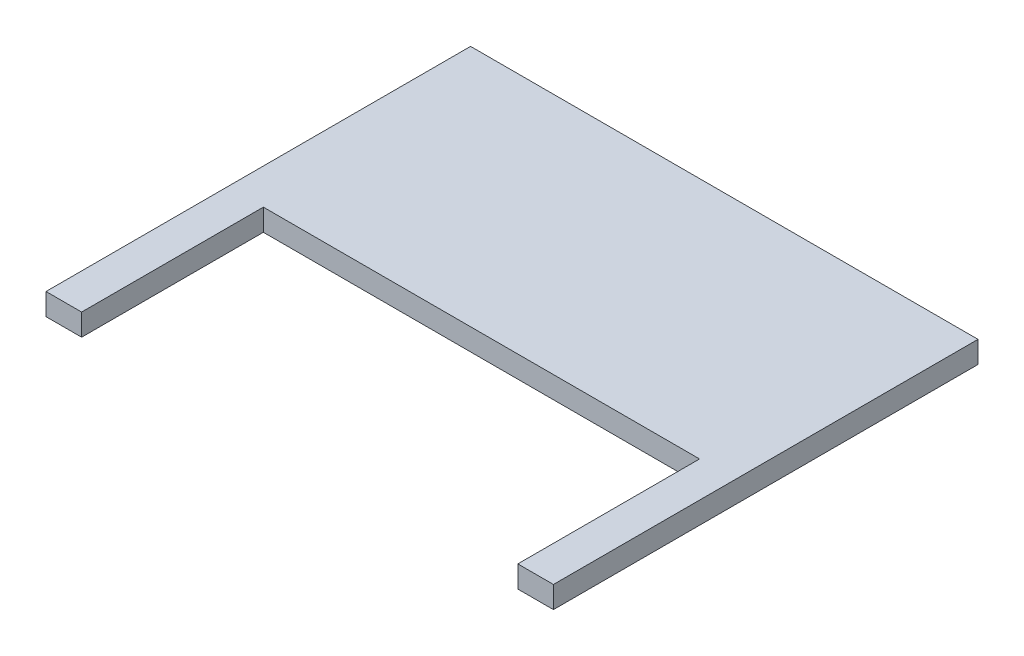
ISO-10303-21;
HEADER;
FILE_DESCRIPTION(('STEP AP214'),'2;1');
FILE_NAME('part.step','',(''),(''),'','','');
FILE_SCHEMA(('AUTOMOTIVE_DESIGN { 1 0 10303 214 1 1 1 1 }'));
ENDSEC;
DATA;
#1=APPLICATION_CONTEXT('core data for automotive mechanical design processes');
#2=APPLICATION_PROTOCOL_DEFINITION('international standard','automotive_design',2000,#1);
#3=PRODUCT_CONTEXT('',#1,'mechanical');
#4=PRODUCT('Part','Part','',(#3));
#5=PRODUCT_RELATED_PRODUCT_CATEGORY('part','',(#4));
#6=PRODUCT_DEFINITION_FORMATION('','',#4);
#7=PRODUCT_DEFINITION_CONTEXT('part definition',#1,'design');
#8=PRODUCT_DEFINITION('design','',#6,#7);
#9=PRODUCT_DEFINITION_SHAPE('','',#8);
#10=(LENGTH_UNIT() NAMED_UNIT(*) SI_UNIT(.MILLI.,.METRE.));
#11=(NAMED_UNIT(*) PLANE_ANGLE_UNIT() SI_UNIT($,.RADIAN.));
#12=(NAMED_UNIT(*) SI_UNIT($,.STERADIAN.) SOLID_ANGLE_UNIT());
#13=UNCERTAINTY_MEASURE_WITH_UNIT(LENGTH_MEASURE(1.E-05),#10,'distance_accuracy_value','');
#14=(GEOMETRIC_REPRESENTATION_CONTEXT(3) GLOBAL_UNCERTAINTY_ASSIGNED_CONTEXT((#13)) GLOBAL_UNIT_ASSIGNED_CONTEXT((#10,
#11,#12)) REPRESENTATION_CONTEXT('',''));
#15=CARTESIAN_POINT('',(0.,0.,0.));
#16=DIRECTION('',(0.,0.,1.));
#17=DIRECTION('',(1.,0.,0.));
#18=AXIS2_PLACEMENT_3D('',#15,#16,#17);
#19=CARTESIAN_POINT('',(0.,3.,33.4));
#20=DIRECTION('',(0.,0.,-1.));
#21=DIRECTION('',(-1.,0.,0.));
#22=AXIS2_PLACEMENT_3D('',#19,#20,#21);
#23=PLANE('',#22);
#24=DIRECTION('',(1.,0.,0.));
#25=VECTOR('',#24,1.);
#26=CARTESIAN_POINT('',(0.,0.,33.4));
#27=LINE('',#26,#25);
#28=CARTESIAN_POINT('',(4.9,0.,33.4));
#29=VERTEX_POINT('',#28);
#30=CARTESIAN_POINT('',(64.9,0.,33.4));
#31=VERTEX_POINT('',#30);
#32=EDGE_CURVE('E194',#29,#31,#27,.T.);
#33=ORIENTED_EDGE('',*,*,#32,.T.);
#34=DIRECTION('',(0.,-1.,0.));
#35=VECTOR('',#34,1.);
#36=CARTESIAN_POINT('',(64.9,3.,33.4));
#37=LINE('',#36,#35);
#38=CARTESIAN_POINT('',(64.9,3.,33.4));
#39=VERTEX_POINT('',#38);
#40=EDGE_CURVE('E11',#39,#31,#37,.T.);
#41=ORIENTED_EDGE('',*,*,#40,.F.);
#42=DIRECTION('',(1.,0.,0.));
#43=VECTOR('',#42,1.);
#44=CARTESIAN_POINT('',(0.,3.,33.4));
#45=LINE('',#44,#43);
#46=CARTESIAN_POINT('',(4.9,3.,33.4));
#47=VERTEX_POINT('',#46);
#48=EDGE_CURVE('E150',#47,#39,#45,.T.);
#49=ORIENTED_EDGE('',*,*,#48,.F.);
#50=DIRECTION('',(0.,-1.,0.));
#51=VECTOR('',#50,1.);
#52=CARTESIAN_POINT('',(4.9,3.,33.4));
#53=LINE('',#52,#51);
#54=EDGE_CURVE('E57',#47,#29,#53,.T.);
#55=ORIENTED_EDGE('',*,*,#54,.T.);
#56=EDGE_LOOP('',(#33,#41,#49,#55));
#57=FACE_BOUND('',#56,.T.);
#58=ADVANCED_FACE('F40',(#57),#23,.F.);
#59=CARTESIAN_POINT('',(64.9,3.,0.));
#60=DIRECTION('',(1.,0.,0.));
#61=DIRECTION('',(0.,0.,-1.));
#62=AXIS2_PLACEMENT_3D('',#59,#60,#61);
#63=PLANE('',#62);
#64=DIRECTION('',(0.,0.,1.));
#65=VECTOR('',#64,1.);
#66=CARTESIAN_POINT('',(64.9,0.,0.));
#67=LINE('',#66,#65);
#68=CARTESIAN_POINT('',(64.9,0.,58.4));
#69=VERTEX_POINT('',#68);
#70=EDGE_CURVE('E185',#31,#69,#67,.T.);
#71=ORIENTED_EDGE('',*,*,#70,.T.);
#72=DIRECTION('',(0.,-1.,0.));
#73=VECTOR('',#72,1.);
#74=CARTESIAN_POINT('',(64.9,3.,58.4));
#75=LINE('',#74,#73);
#76=CARTESIAN_POINT('',(64.9,3.,58.4));
#77=VERTEX_POINT('',#76);
#78=EDGE_CURVE('E49',#77,#69,#75,.T.);
#79=ORIENTED_EDGE('',*,*,#78,.F.);
#80=DIRECTION('',(0.,0.,1.));
#81=VECTOR('',#80,1.);
#82=CARTESIAN_POINT('',(64.9,3.,0.));
#83=LINE('',#82,#81);
#84=EDGE_CURVE('E96',#39,#77,#83,.T.);
#85=ORIENTED_EDGE('',*,*,#84,.F.);
#86=ORIENTED_EDGE('',*,*,#40,.T.);
#87=EDGE_LOOP('',(#71,#79,#85,#86));
#88=FACE_BOUND('',#87,.T.);
#89=ADVANCED_FACE('F211',(#88),#63,.F.);
#90=CARTESIAN_POINT('',(0.,3.,58.4));
#91=DIRECTION('',(0.,0.,-1.));
#92=DIRECTION('',(-1.,0.,0.));
#93=AXIS2_PLACEMENT_3D('',#90,#91,#92);
#94=PLANE('',#93);
#95=DIRECTION('',(1.,0.,0.));
#96=VECTOR('',#95,1.);
#97=CARTESIAN_POINT('',(0.,0.,58.4));
#98=LINE('',#97,#96);
#99=CARTESIAN_POINT('',(69.8,0.,58.4));
#100=VERTEX_POINT('',#99);
#101=EDGE_CURVE('E162',#69,#100,#98,.T.);
#102=ORIENTED_EDGE('',*,*,#101,.T.);
#103=DIRECTION('',(0.,-1.,0.));
#104=VECTOR('',#103,1.);
#105=CARTESIAN_POINT('',(69.8,3.,58.4));
#106=LINE('',#105,#104);
#107=CARTESIAN_POINT('',(69.8,3.,58.4));
#108=VERTEX_POINT('',#107);
#109=EDGE_CURVE('E175',#108,#100,#106,.T.);
#110=ORIENTED_EDGE('',*,*,#109,.F.);
#111=DIRECTION('',(1.,0.,0.));
#112=VECTOR('',#111,1.);
#113=CARTESIAN_POINT('',(0.,3.,58.4));
#114=LINE('',#113,#112);
#115=EDGE_CURVE('E138',#77,#108,#114,.T.);
#116=ORIENTED_EDGE('',*,*,#115,.F.);
#117=ORIENTED_EDGE('',*,*,#78,.T.);
#118=EDGE_LOOP('',(#102,#110,#116,#117));
#119=FACE_BOUND('',#118,.T.);
#120=ADVANCED_FACE('F182',(#119),#94,.F.);
#121=CARTESIAN_POINT('',(69.8,3.,0.));
#122=DIRECTION('',(1.,0.,0.));
#123=DIRECTION('',(0.,0.,-1.));
#124=AXIS2_PLACEMENT_3D('',#121,#122,#123);
#125=PLANE('',#124);
#126=DIRECTION('',(0.,0.,1.));
#127=VECTOR('',#126,1.);
#128=CARTESIAN_POINT('',(69.8,0.,0.));
#129=LINE('',#128,#127);
#130=CARTESIAN_POINT('',(69.8,0.,0.));
#131=VERTEX_POINT('',#130);
#132=EDGE_CURVE('E188',#131,#100,#129,.T.);
#133=ORIENTED_EDGE('',*,*,#132,.F.);
#134=DIRECTION('',(0.,-1.,0.));
#135=VECTOR('',#134,1.);
#136=CARTESIAN_POINT('',(69.8,3.,0.));
#137=LINE('',#136,#135);
#138=CARTESIAN_POINT('',(69.8,3.,0.));
#139=VERTEX_POINT('',#138);
#140=EDGE_CURVE('E172',#139,#131,#137,.T.);
#141=ORIENTED_EDGE('',*,*,#140,.F.);
#142=DIRECTION('',(0.,0.,1.));
#143=VECTOR('',#142,1.);
#144=CARTESIAN_POINT('',(69.8,3.,0.));
#145=LINE('',#144,#143);
#146=EDGE_CURVE('E144',#139,#108,#145,.T.);
#147=ORIENTED_EDGE('',*,*,#146,.T.);
#148=ORIENTED_EDGE('',*,*,#109,.T.);
#149=EDGE_LOOP('',(#133,#141,#147,#148));
#150=FACE_BOUND('',#149,.T.);
#151=ADVANCED_FACE('F203',(#150),#125,.T.);
#152=CARTESIAN_POINT('',(0.,3.,0.));
#153=DIRECTION('',(0.,0.,-1.));
#154=DIRECTION('',(-1.,0.,0.));
#155=AXIS2_PLACEMENT_3D('',#152,#153,#154);
#156=PLANE('',#155);
#157=DIRECTION('',(1.,0.,0.));
#158=VECTOR('',#157,1.);
#159=CARTESIAN_POINT('',(0.,0.,0.));
#160=LINE('',#159,#158);
#161=CARTESIAN_POINT('',(0.,0.,0.));
#162=VERTEX_POINT('',#161);
#163=EDGE_CURVE('E192',#162,#131,#160,.T.);
#164=ORIENTED_EDGE('',*,*,#163,.F.);
#165=DIRECTION('',(0.,-1.,0.));
#166=VECTOR('',#165,1.);
#167=CARTESIAN_POINT('',(0.,3.,0.));
#168=LINE('',#167,#166);
#169=CARTESIAN_POINT('',(0.,3.,0.));
#170=VERTEX_POINT('',#169);
#171=EDGE_CURVE('E132',#170,#162,#168,.T.);
#172=ORIENTED_EDGE('',*,*,#171,.F.);
#173=DIRECTION('',(1.,0.,0.));
#174=VECTOR('',#173,1.);
#175=CARTESIAN_POINT('',(0.,3.,0.));
#176=LINE('',#175,#174);
#177=EDGE_CURVE('E120',#170,#139,#176,.T.);
#178=ORIENTED_EDGE('',*,*,#177,.T.);
#179=ORIENTED_EDGE('',*,*,#140,.T.);
#180=EDGE_LOOP('',(#164,#172,#178,#179));
#181=FACE_BOUND('',#180,.T.);
#182=ADVANCED_FACE('F201',(#181),#156,.T.);
#183=CARTESIAN_POINT('',(0.,3.,0.));
#184=DIRECTION('',(1.,0.,0.));
#185=DIRECTION('',(0.,0.,-1.));
#186=AXIS2_PLACEMENT_3D('',#183,#184,#185);
#187=PLANE('',#186);
#188=DIRECTION('',(0.,0.,1.));
#189=VECTOR('',#188,1.);
#190=CARTESIAN_POINT('',(0.,0.,0.));
#191=LINE('',#190,#189);
#192=CARTESIAN_POINT('',(0.,0.,58.4));
#193=VERTEX_POINT('',#192);
#194=EDGE_CURVE('E128',#162,#193,#191,.T.);
#195=ORIENTED_EDGE('',*,*,#194,.T.);
#196=DIRECTION('',(0.,-1.,0.));
#197=VECTOR('',#196,1.);
#198=CARTESIAN_POINT('',(0.,3.,58.4));
#199=LINE('',#198,#197);
#200=CARTESIAN_POINT('',(0.,3.,58.4));
#201=VERTEX_POINT('',#200);
#202=EDGE_CURVE('E125',#201,#193,#199,.T.);
#203=ORIENTED_EDGE('',*,*,#202,.F.);
#204=DIRECTION('',(0.,0.,1.));
#205=VECTOR('',#204,1.);
#206=CARTESIAN_POINT('',(0.,3.,0.));
#207=LINE('',#206,#205);
#208=EDGE_CURVE('E112',#170,#201,#207,.T.);
#209=ORIENTED_EDGE('',*,*,#208,.F.);
#210=ORIENTED_EDGE('',*,*,#171,.T.);
#211=EDGE_LOOP('',(#195,#203,#209,#210));
#212=FACE_BOUND('',#211,.T.);
#213=ADVANCED_FACE('F126',(#212),#187,.F.);
#214=CARTESIAN_POINT('',(4.90000000000001,0.,58.4));
#215=VERTEX_POINT('',#214);
#216=EDGE_CURVE('E157',#193,#215,#98,.T.);
#217=ORIENTED_EDGE('',*,*,#216,.T.);
#218=DIRECTION('',(0.,-1.,0.));
#219=VECTOR('',#218,1.);
#220=CARTESIAN_POINT('',(4.90000000000001,3.,58.4));
#221=LINE('',#220,#219);
#222=CARTESIAN_POINT('',(4.90000000000001,3.,58.4));
#223=VERTEX_POINT('',#222);
#224=EDGE_CURVE('E84',#223,#215,#221,.T.);
#225=ORIENTED_EDGE('',*,*,#224,.F.);
#226=EDGE_CURVE('E117',#201,#223,#114,.T.);
#227=ORIENTED_EDGE('',*,*,#226,.F.);
#228=ORIENTED_EDGE('',*,*,#202,.T.);
#229=EDGE_LOOP('',(#217,#225,#227,#228));
#230=FACE_BOUND('',#229,.T.);
#231=ADVANCED_FACE('F134',(#230),#94,.F.);
#232=CARTESIAN_POINT('',(4.9,3.,0.));
#233=DIRECTION('',(1.,0.,0.));
#234=DIRECTION('',(0.,0.,-1.));
#235=AXIS2_PLACEMENT_3D('',#232,#233,#234);
#236=PLANE('',#235);
#237=DIRECTION('',(0.,0.,1.));
#238=VECTOR('',#237,1.);
#239=CARTESIAN_POINT('',(4.9,0.,0.));
#240=LINE('',#239,#238);
#241=EDGE_CURVE('E152',#29,#215,#240,.T.);
#242=ORIENTED_EDGE('',*,*,#241,.F.);
#243=ORIENTED_EDGE('',*,*,#54,.F.);
#244=DIRECTION('',(0.,0.,1.));
#245=VECTOR('',#244,1.);
#246=CARTESIAN_POINT('',(4.9,3.,0.));
#247=LINE('',#246,#245);
#248=EDGE_CURVE('E136',#47,#223,#247,.T.);
#249=ORIENTED_EDGE('',*,*,#248,.T.);
#250=ORIENTED_EDGE('',*,*,#224,.T.);
#251=EDGE_LOOP('',(#242,#243,#249,#250));
#252=FACE_BOUND('',#251,.T.);
#253=ADVANCED_FACE('F220',(#252),#236,.T.);
#254=CARTESIAN_POINT('',(0.,3.,0.));
#255=DIRECTION('',(0.,1.,0.));
#256=DIRECTION('',(0.,0.,1.));
#257=AXIS2_PLACEMENT_3D('',#254,#255,#256);
#258=PLANE('',#257);
#259=ORIENTED_EDGE('',*,*,#48,.T.);
#260=ORIENTED_EDGE('',*,*,#84,.T.);
#261=ORIENTED_EDGE('',*,*,#115,.T.);
#262=ORIENTED_EDGE('',*,*,#146,.F.);
#263=ORIENTED_EDGE('',*,*,#177,.F.);
#264=ORIENTED_EDGE('',*,*,#208,.T.);
#265=ORIENTED_EDGE('',*,*,#226,.T.);
#266=ORIENTED_EDGE('',*,*,#248,.F.);
#267=EDGE_LOOP('',(#259,#260,#261,#262,#263,#264,#265,#266));
#268=FACE_BOUND('',#267,.T.);
#269=ADVANCED_FACE('F114',(#268),#258,.T.);
#270=CARTESIAN_POINT('',(0.,0.,0.));
#271=DIRECTION('',(0.,1.,0.));
#272=DIRECTION('',(0.,0.,1.));
#273=AXIS2_PLACEMENT_3D('',#270,#271,#272);
#274=PLANE('',#273);
#275=ORIENTED_EDGE('',*,*,#32,.F.);
#276=ORIENTED_EDGE('',*,*,#241,.T.);
#277=ORIENTED_EDGE('',*,*,#216,.F.);
#278=ORIENTED_EDGE('',*,*,#194,.F.);
#279=ORIENTED_EDGE('',*,*,#163,.T.);
#280=ORIENTED_EDGE('',*,*,#132,.T.);
#281=ORIENTED_EDGE('',*,*,#101,.F.);
#282=ORIENTED_EDGE('',*,*,#70,.F.);
#283=EDGE_LOOP('',(#275,#276,#277,#278,#279,#280,#281,#282));
#284=FACE_BOUND('',#283,.T.);
#285=ADVANCED_FACE('F184',(#284),#274,.F.);
#286=CLOSED_SHELL('',(#58,#89,#120,#151,#182,#213,#231,#253,#269,#285));
#287=MANIFOLD_SOLID_BREP('B2',#286);
#288=ADVANCED_BREP_SHAPE_REPRESENTATION('',(#18,#287),#14);
#289=SHAPE_DEFINITION_REPRESENTATION(#9,#288);
ENDSEC;
END-ISO-10303-21;
